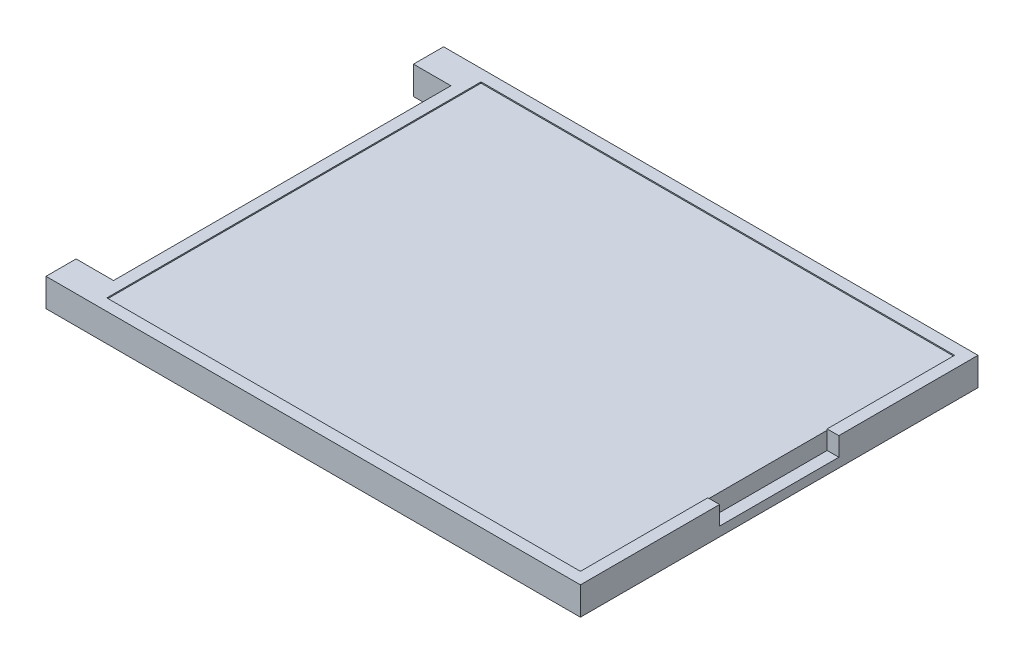
ISO-10303-21;
HEADER;
FILE_DESCRIPTION(('STEP AP214'),'2;1');
FILE_NAME('part.step','',(''),(''),'','','');
FILE_SCHEMA(('AUTOMOTIVE_DESIGN { 1 0 10303 214 1 1 1 1 }'));
ENDSEC;
DATA;
#1=APPLICATION_CONTEXT('core data for automotive mechanical design processes');
#2=APPLICATION_PROTOCOL_DEFINITION('international standard','automotive_design',2000,#1);
#3=PRODUCT_CONTEXT('',#1,'mechanical');
#4=PRODUCT('Part','Part','',(#3));
#5=PRODUCT_RELATED_PRODUCT_CATEGORY('part','',(#4));
#6=PRODUCT_DEFINITION_FORMATION('','',#4);
#7=PRODUCT_DEFINITION_CONTEXT('part definition',#1,'design');
#8=PRODUCT_DEFINITION('design','',#6,#7);
#9=PRODUCT_DEFINITION_SHAPE('','',#8);
#10=(LENGTH_UNIT() NAMED_UNIT(*) SI_UNIT(.MILLI.,.METRE.));
#11=(NAMED_UNIT(*) PLANE_ANGLE_UNIT() SI_UNIT($,.RADIAN.));
#12=(NAMED_UNIT(*) SI_UNIT($,.STERADIAN.) SOLID_ANGLE_UNIT());
#13=UNCERTAINTY_MEASURE_WITH_UNIT(LENGTH_MEASURE(1.E-05),#10,'distance_accuracy_value','');
#14=(GEOMETRIC_REPRESENTATION_CONTEXT(3) GLOBAL_UNCERTAINTY_ASSIGNED_CONTEXT((#13)) GLOBAL_UNIT_ASSIGNED_CONTEXT((#10,
#11,#12)) REPRESENTATION_CONTEXT('',''));
#15=CARTESIAN_POINT('',(0.,0.,0.));
#16=DIRECTION('',(0.,0.,1.));
#17=DIRECTION('',(1.,0.,0.));
#18=AXIS2_PLACEMENT_3D('',#15,#16,#17);
#19=CARTESIAN_POINT('',(23.8,4.,-16.));
#20=DIRECTION('',(1.,0.,0.));
#21=DIRECTION('',(0.,0.,-1.));
#22=AXIS2_PLACEMENT_3D('',#19,#20,#21);
#23=PLANE('',#22);
#24=DIRECTION('',(0.,0.,-1.));
#25=VECTOR('',#24,1.);
#26=CARTESIAN_POINT('',(23.8,4.1,-16.));
#27=LINE('',#26,#25);
#28=CARTESIAN_POINT('',(23.8,4.1,16.));
#29=VERTEX_POINT('',#28);
#30=CARTESIAN_POINT('',(23.8,4.1,5.1));
#31=VERTEX_POINT('',#30);
#32=EDGE_CURVE('E209',#29,#31,#27,.T.);
#33=ORIENTED_EDGE('',*,*,#32,.T.);
#34=DIRECTION('',(0.,1.,0.));
#35=VECTOR('',#34,1.);
#36=CARTESIAN_POINT('',(23.8,2.5,5.1));
#37=LINE('',#36,#35);
#38=CARTESIAN_POINT('',(23.8,4.,5.1));
#39=VERTEX_POINT('',#38);
#40=EDGE_CURVE('E316',#39,#31,#37,.T.);
#41=ORIENTED_EDGE('',*,*,#40,.F.);
#42=DIRECTION('',(0.,0.,-1.));
#43=VECTOR('',#42,1.);
#44=CARTESIAN_POINT('',(23.8,4.,-16.));
#45=LINE('',#44,#43);
#46=CARTESIAN_POINT('',(23.8,4.,16.));
#47=VERTEX_POINT('',#46);
#48=EDGE_CURVE('E195',#47,#39,#45,.T.);
#49=ORIENTED_EDGE('',*,*,#48,.F.);
#50=DIRECTION('',(0.,1.,0.));
#51=VECTOR('',#50,1.);
#52=CARTESIAN_POINT('',(23.8,4.,16.));
#53=LINE('',#52,#51);
#54=EDGE_CURVE('E220',#47,#29,#53,.T.);
#55=ORIENTED_EDGE('',*,*,#54,.T.);
#56=EDGE_LOOP('',(#33,#41,#49,#55));
#57=FACE_BOUND('',#56,.T.);
#58=ADVANCED_FACE('F38',(#57),#23,.F.);
#59=CARTESIAN_POINT('',(0.,4.1,-14.425));
#60=DIRECTION('',(0.,0.,-1.));
#61=DIRECTION('',(-1.,0.,0.));
#62=AXIS2_PLACEMENT_3D('',#59,#60,#61);
#63=PLANE('',#62);
#64=DIRECTION('',(1.,0.,0.));
#65=VECTOR('',#64,1.);
#66=CARTESIAN_POINT('',(0.,1.7,-14.425));
#67=LINE('',#66,#65);
#68=CARTESIAN_POINT('',(-20.9,1.7,-14.425));
#69=VERTEX_POINT('',#68);
#70=CARTESIAN_POINT('',(-17.7,1.7,-14.425));
#71=VERTEX_POINT('',#70);
#72=EDGE_CURVE('E216',#69,#71,#67,.T.);
#73=ORIENTED_EDGE('',*,*,#72,.T.);
#74=DIRECTION('',(0.,-1.,0.));
#75=VECTOR('',#74,1.);
#76=CARTESIAN_POINT('',(-17.7,4.1,-14.425));
#77=LINE('',#76,#75);
#78=CARTESIAN_POINT('',(-17.7,4.1,-14.425));
#79=VERTEX_POINT('',#78);
#80=EDGE_CURVE('E11',#79,#71,#77,.T.);
#81=ORIENTED_EDGE('',*,*,#80,.F.);
#82=DIRECTION('',(1.,0.,0.));
#83=VECTOR('',#82,1.);
#84=CARTESIAN_POINT('',(0.,4.1,-14.425));
#85=LINE('',#84,#83);
#86=CARTESIAN_POINT('',(-20.9,4.1,-14.425));
#87=VERTEX_POINT('',#86);
#88=EDGE_CURVE('E223',#87,#79,#85,.T.);
#89=ORIENTED_EDGE('',*,*,#88,.F.);
#90=DIRECTION('',(0.,-1.,0.));
#91=VECTOR('',#90,1.);
#92=CARTESIAN_POINT('',(-20.9,4.1,-14.425));
#93=LINE('',#92,#91);
#94=EDGE_CURVE('E258',#87,#69,#93,.T.);
#95=ORIENTED_EDGE('',*,*,#94,.T.);
#96=EDGE_LOOP('',(#73,#81,#89,#95));
#97=FACE_BOUND('',#96,.T.);
#98=ADVANCED_FACE('F40',(#97),#63,.F.);
#99=CARTESIAN_POINT('',(-17.7,4.1,0.));
#100=DIRECTION('',(1.,0.,0.));
#101=DIRECTION('',(0.,0.,-1.));
#102=AXIS2_PLACEMENT_3D('',#99,#100,#101);
#103=PLANE('',#102);
#104=DIRECTION('',(0.,0.,1.));
#105=VECTOR('',#104,1.);
#106=CARTESIAN_POINT('',(-17.7,1.7,0.));
#107=LINE('',#106,#105);
#108=CARTESIAN_POINT('',(-17.7,1.7,14.425));
#109=VERTEX_POINT('',#108);
#110=EDGE_CURVE('E244',#71,#109,#107,.T.);
#111=ORIENTED_EDGE('',*,*,#110,.T.);
#112=DIRECTION('',(0.,-1.,0.));
#113=VECTOR('',#112,1.);
#114=CARTESIAN_POINT('',(-17.7,4.1,14.425));
#115=LINE('',#114,#113);
#116=CARTESIAN_POINT('',(-17.7,4.1,14.425));
#117=VERTEX_POINT('',#116);
#118=EDGE_CURVE('E46',#117,#109,#115,.T.);
#119=ORIENTED_EDGE('',*,*,#118,.F.);
#120=DIRECTION('',(0.,0.,1.));
#121=VECTOR('',#120,1.);
#122=CARTESIAN_POINT('',(-17.7,4.1,0.));
#123=LINE('',#122,#121);
#124=EDGE_CURVE('E226',#79,#117,#123,.T.);
#125=ORIENTED_EDGE('',*,*,#124,.F.);
#126=ORIENTED_EDGE('',*,*,#80,.T.);
#127=EDGE_LOOP('',(#111,#119,#125,#126));
#128=FACE_BOUND('',#127,.T.);
#129=ADVANCED_FACE('F280',(#128),#103,.F.);
#130=CARTESIAN_POINT('',(0.,4.1,14.425));
#131=DIRECTION('',(0.,0.,-1.));
#132=DIRECTION('',(-1.,0.,0.));
#133=AXIS2_PLACEMENT_3D('',#130,#131,#132);
#134=PLANE('',#133);
#135=DIRECTION('',(1.,0.,0.));
#136=VECTOR('',#135,1.);
#137=CARTESIAN_POINT('',(0.,1.7,14.425));
#138=LINE('',#137,#136);
#139=CARTESIAN_POINT('',(-20.9,1.7,14.425));
#140=VERTEX_POINT('',#139);
#141=EDGE_CURVE('E247',#140,#109,#138,.T.);
#142=ORIENTED_EDGE('',*,*,#141,.F.);
#143=DIRECTION('',(0.,-1.,0.));
#144=VECTOR('',#143,1.);
#145=CARTESIAN_POINT('',(-20.9,4.1,14.425));
#146=LINE('',#145,#144);
#147=CARTESIAN_POINT('',(-20.9,4.1,14.425));
#148=VERTEX_POINT('',#147);
#149=EDGE_CURVE('E273',#148,#140,#146,.T.);
#150=ORIENTED_EDGE('',*,*,#149,.F.);
#151=DIRECTION('',(1.,0.,0.));
#152=VECTOR('',#151,1.);
#153=CARTESIAN_POINT('',(0.,4.1,14.425));
#154=LINE('',#153,#152);
#155=EDGE_CURVE('E229',#148,#117,#154,.T.);
#156=ORIENTED_EDGE('',*,*,#155,.T.);
#157=ORIENTED_EDGE('',*,*,#118,.T.);
#158=EDGE_LOOP('',(#142,#150,#156,#157));
#159=FACE_BOUND('',#158,.T.);
#160=ADVANCED_FACE('F277',(#159),#134,.T.);
#161=CARTESIAN_POINT('',(-20.9,4.1,0.));
#162=DIRECTION('',(1.,0.,0.));
#163=DIRECTION('',(0.,0.,-1.));
#164=AXIS2_PLACEMENT_3D('',#161,#162,#163);
#165=PLANE('',#164);
#166=DIRECTION('',(0.,0.,1.));
#167=VECTOR('',#166,1.);
#168=CARTESIAN_POINT('',(-20.9,1.7,0.));
#169=LINE('',#168,#167);
#170=CARTESIAN_POINT('',(-20.9,1.7,17.));
#171=VERTEX_POINT('',#170);
#172=EDGE_CURVE('E250',#140,#171,#169,.T.);
#173=ORIENTED_EDGE('',*,*,#172,.T.);
#174=DIRECTION('',(0.,-1.,0.));
#175=VECTOR('',#174,1.);
#176=CARTESIAN_POINT('',(-20.9,4.1,17.));
#177=LINE('',#176,#175);
#178=CARTESIAN_POINT('',(-20.9,4.1,17.));
#179=VERTEX_POINT('',#178);
#180=EDGE_CURVE('E270',#179,#171,#177,.T.);
#181=ORIENTED_EDGE('',*,*,#180,.F.);
#182=DIRECTION('',(0.,0.,1.));
#183=VECTOR('',#182,1.);
#184=CARTESIAN_POINT('',(-20.9,4.1,0.));
#185=LINE('',#184,#183);
#186=EDGE_CURVE('E232',#148,#179,#185,.T.);
#187=ORIENTED_EDGE('',*,*,#186,.F.);
#188=ORIENTED_EDGE('',*,*,#149,.T.);
#189=EDGE_LOOP('',(#173,#181,#187,#188));
#190=FACE_BOUND('',#189,.T.);
#191=ADVANCED_FACE('F290',(#190),#165,.F.);
#192=CARTESIAN_POINT('',(0.,4.1,17.));
#193=DIRECTION('',(0.,0.,-1.));
#194=DIRECTION('',(-1.,0.,0.));
#195=AXIS2_PLACEMENT_3D('',#192,#193,#194);
#196=PLANE('',#195);
#197=DIRECTION('',(1.,0.,0.));
#198=VECTOR('',#197,1.);
#199=CARTESIAN_POINT('',(0.,1.7,17.));
#200=LINE('',#199,#198);
#201=CARTESIAN_POINT('',(24.8,1.7,17.));
#202=VERTEX_POINT('',#201);
#203=EDGE_CURVE('E252',#171,#202,#200,.T.);
#204=ORIENTED_EDGE('',*,*,#203,.T.);
#205=DIRECTION('',(0.,-1.,0.));
#206=VECTOR('',#205,1.);
#207=CARTESIAN_POINT('',(24.8,4.1,17.));
#208=LINE('',#207,#206);
#209=CARTESIAN_POINT('',(24.8,4.1,17.));
#210=VERTEX_POINT('',#209);
#211=EDGE_CURVE('E267',#210,#202,#208,.T.);
#212=ORIENTED_EDGE('',*,*,#211,.F.);
#213=DIRECTION('',(1.,0.,0.));
#214=VECTOR('',#213,1.);
#215=CARTESIAN_POINT('',(0.,4.1,17.));
#216=LINE('',#215,#214);
#217=EDGE_CURVE('E234',#179,#210,#216,.T.);
#218=ORIENTED_EDGE('',*,*,#217,.F.);
#219=ORIENTED_EDGE('',*,*,#180,.T.);
#220=EDGE_LOOP('',(#204,#212,#218,#219));
#221=FACE_BOUND('',#220,.T.);
#222=ADVANCED_FACE('F294',(#221),#196,.F.);
#223=CARTESIAN_POINT('',(24.8,4.1,0.));
#224=DIRECTION('',(-1.,0.,0.));
#225=DIRECTION('',(0.,0.,1.));
#226=AXIS2_PLACEMENT_3D('',#223,#224,#225);
#227=PLANE('',#226);
#228=DIRECTION('',(0.,0.,-1.));
#229=VECTOR('',#228,1.);
#230=CARTESIAN_POINT('',(24.8,2.5,-5.1));
#231=LINE('',#230,#229);
#232=CARTESIAN_POINT('',(24.8,2.5,5.1));
#233=VERTEX_POINT('',#232);
#234=CARTESIAN_POINT('',(24.8,2.5,-5.1));
#235=VERTEX_POINT('',#234);
#236=EDGE_CURVE('E165',#233,#235,#231,.T.);
#237=ORIENTED_EDGE('',*,*,#236,.F.);
#238=DIRECTION('',(0.,1.,0.));
#239=VECTOR('',#238,1.);
#240=CARTESIAN_POINT('',(24.8,2.5,5.1));
#241=LINE('',#240,#239);
#242=CARTESIAN_POINT('',(24.8,4.1,5.1));
#243=VERTEX_POINT('',#242);
#244=EDGE_CURVE('E205',#233,#243,#241,.T.);
#245=ORIENTED_EDGE('',*,*,#244,.T.);
#246=DIRECTION('',(0.,0.,-1.));
#247=VECTOR('',#246,1.);
#248=CARTESIAN_POINT('',(24.8,4.1,0.));
#249=LINE('',#248,#247);
#250=EDGE_CURVE('E237',#210,#243,#249,.T.);
#251=ORIENTED_EDGE('',*,*,#250,.F.);
#252=ORIENTED_EDGE('',*,*,#211,.T.);
#253=DIRECTION('',(0.,0.,-1.));
#254=VECTOR('',#253,1.);
#255=CARTESIAN_POINT('',(24.8,1.7,0.));
#256=LINE('',#255,#254);
#257=CARTESIAN_POINT('',(24.8,1.7,-17.));
#258=VERTEX_POINT('',#257);
#259=EDGE_CURVE('E254',#202,#258,#256,.T.);
#260=ORIENTED_EDGE('',*,*,#259,.T.);
#261=DIRECTION('',(0.,-1.,0.));
#262=VECTOR('',#261,1.);
#263=CARTESIAN_POINT('',(24.8,4.1,-17.));
#264=LINE('',#263,#262);
#265=CARTESIAN_POINT('',(24.8,4.1,-17.));
#266=VERTEX_POINT('',#265);
#267=EDGE_CURVE('E264',#266,#258,#264,.T.);
#268=ORIENTED_EDGE('',*,*,#267,.F.);
#269=CARTESIAN_POINT('',(24.8,4.1,-5.1));
#270=VERTEX_POINT('',#269);
#271=EDGE_CURVE('E179',#270,#266,#249,.T.);
#272=ORIENTED_EDGE('',*,*,#271,.F.);
#273=DIRECTION('',(0.,1.,0.));
#274=VECTOR('',#273,1.);
#275=CARTESIAN_POINT('',(24.8,2.5,-5.1));
#276=LINE('',#275,#274);
#277=EDGE_CURVE('E160',#235,#270,#276,.T.);
#278=ORIENTED_EDGE('',*,*,#277,.F.);
#279=EDGE_LOOP('',(#237,#245,#251,#252,#260,#268,#272,#278));
#280=FACE_BOUND('',#279,.T.);
#281=ADVANCED_FACE('F177',(#280),#227,.F.);
#282=CARTESIAN_POINT('',(0.,4.1,-17.));
#283=DIRECTION('',(0.,0.,1.));
#284=DIRECTION('',(1.,0.,0.));
#285=AXIS2_PLACEMENT_3D('',#282,#283,#284);
#286=PLANE('',#285);
#287=DIRECTION('',(-1.,0.,0.));
#288=VECTOR('',#287,1.);
#289=CARTESIAN_POINT('',(0.,1.7,-17.));
#290=LINE('',#289,#288);
#291=CARTESIAN_POINT('',(-20.9,1.7,-17.));
#292=VERTEX_POINT('',#291);
#293=EDGE_CURVE('E256',#258,#292,#290,.T.);
#294=ORIENTED_EDGE('',*,*,#293,.T.);
#295=DIRECTION('',(0.,-1.,0.));
#296=VECTOR('',#295,1.);
#297=CARTESIAN_POINT('',(-20.9,4.1,-17.));
#298=LINE('',#297,#296);
#299=CARTESIAN_POINT('',(-20.9,4.1,-17.));
#300=VERTEX_POINT('',#299);
#301=EDGE_CURVE('E261',#300,#292,#298,.T.);
#302=ORIENTED_EDGE('',*,*,#301,.F.);
#303=DIRECTION('',(-1.,0.,0.));
#304=VECTOR('',#303,1.);
#305=CARTESIAN_POINT('',(0.,4.1,-17.));
#306=LINE('',#305,#304);
#307=EDGE_CURVE('E240',#266,#300,#306,.T.);
#308=ORIENTED_EDGE('',*,*,#307,.F.);
#309=ORIENTED_EDGE('',*,*,#267,.T.);
#310=EDGE_LOOP('',(#294,#302,#308,#309));
#311=FACE_BOUND('',#310,.T.);
#312=ADVANCED_FACE('F311',(#311),#286,.F.);
#313=EDGE_CURVE('E227',#292,#69,#169,.T.);
#314=ORIENTED_EDGE('',*,*,#313,.T.);
#315=ORIENTED_EDGE('',*,*,#94,.F.);
#316=EDGE_CURVE('E235',#300,#87,#185,.T.);
#317=ORIENTED_EDGE('',*,*,#316,.F.);
#318=ORIENTED_EDGE('',*,*,#301,.T.);
#319=EDGE_LOOP('',(#314,#315,#317,#318));
#320=FACE_BOUND('',#319,.T.);
#321=ADVANCED_FACE('F307',(#320),#165,.F.);
#322=CARTESIAN_POINT('',(0.,4.1,0.));
#323=DIRECTION('',(0.,1.,0.));
#324=DIRECTION('',(0.,0.,1.));
#325=AXIS2_PLACEMENT_3D('',#322,#323,#324);
#326=PLANE('',#325);
#327=DIRECTION('',(1.,0.,0.));
#328=VECTOR('',#327,1.);
#329=CARTESIAN_POINT('',(24.8,4.1,5.1));
#330=LINE('',#329,#328);
#331=EDGE_CURVE('E174',#31,#243,#330,.T.);
#332=ORIENTED_EDGE('',*,*,#331,.F.);
#333=ORIENTED_EDGE('',*,*,#32,.F.);
#334=DIRECTION('',(1.,0.,0.));
#335=VECTOR('',#334,1.);
#336=CARTESIAN_POINT('',(-16.7,4.1,16.));
#337=LINE('',#336,#335);
#338=CARTESIAN_POINT('',(-16.7,4.1,16.));
#339=VERTEX_POINT('',#338);
#340=EDGE_CURVE('E204',#339,#29,#337,.T.);
#341=ORIENTED_EDGE('',*,*,#340,.F.);
#342=DIRECTION('',(0.,0.,1.));
#343=VECTOR('',#342,1.);
#344=CARTESIAN_POINT('',(-16.7,4.1,-16.));
#345=LINE('',#344,#343);
#346=CARTESIAN_POINT('',(-16.7,4.1,-16.));
#347=VERTEX_POINT('',#346);
#348=EDGE_CURVE('E61',#347,#339,#345,.T.);
#349=ORIENTED_EDGE('',*,*,#348,.F.);
#350=DIRECTION('',(-1.,0.,0.));
#351=VECTOR('',#350,1.);
#352=CARTESIAN_POINT('',(-16.7,4.1,-16.));
#353=LINE('',#352,#351);
#354=CARTESIAN_POINT('',(23.8,4.1,-16.));
#355=VERTEX_POINT('',#354);
#356=EDGE_CURVE('E191',#355,#347,#353,.T.);
#357=ORIENTED_EDGE('',*,*,#356,.F.);
#358=CARTESIAN_POINT('',(23.8,4.1,-5.1));
#359=VERTEX_POINT('',#358);
#360=EDGE_CURVE('E208',#359,#355,#27,.T.);
#361=ORIENTED_EDGE('',*,*,#360,.F.);
#362=DIRECTION('',(-1.,0.,0.));
#363=VECTOR('',#362,1.);
#364=CARTESIAN_POINT('',(24.8,4.1,-5.1));
#365=LINE('',#364,#363);
#366=EDGE_CURVE('E319',#270,#359,#365,.T.);
#367=ORIENTED_EDGE('',*,*,#366,.F.);
#368=ORIENTED_EDGE('',*,*,#271,.T.);
#369=ORIENTED_EDGE('',*,*,#307,.T.);
#370=ORIENTED_EDGE('',*,*,#316,.T.);
#371=ORIENTED_EDGE('',*,*,#88,.T.);
#372=ORIENTED_EDGE('',*,*,#124,.T.);
#373=ORIENTED_EDGE('',*,*,#155,.F.);
#374=ORIENTED_EDGE('',*,*,#186,.T.);
#375=ORIENTED_EDGE('',*,*,#217,.T.);
#376=ORIENTED_EDGE('',*,*,#250,.T.);
#377=EDGE_LOOP('',(#332,#333,#341,#349,#357,#361,#367,#368,#369,#370,#371,#372,#373,#374,#375,#376));
#378=FACE_BOUND('',#377,.T.);
#379=ADVANCED_FACE('F299',(#378),#326,.T.);
#380=CARTESIAN_POINT('',(0.,1.7,0.));
#381=DIRECTION('',(0.,1.,0.));
#382=DIRECTION('',(0.,0.,1.));
#383=AXIS2_PLACEMENT_3D('',#380,#381,#382);
#384=PLANE('',#383);
#385=ORIENTED_EDGE('',*,*,#72,.F.);
#386=ORIENTED_EDGE('',*,*,#313,.F.);
#387=ORIENTED_EDGE('',*,*,#293,.F.);
#388=ORIENTED_EDGE('',*,*,#259,.F.);
#389=ORIENTED_EDGE('',*,*,#203,.F.);
#390=ORIENTED_EDGE('',*,*,#172,.F.);
#391=ORIENTED_EDGE('',*,*,#141,.T.);
#392=ORIENTED_EDGE('',*,*,#110,.F.);
#393=EDGE_LOOP('',(#385,#386,#387,#388,#389,#390,#391,#392));
#394=FACE_BOUND('',#393,.T.);
#395=ADVANCED_FACE('F285',(#394),#384,.F.);
#396=CARTESIAN_POINT('',(-16.7,4.,-16.));
#397=DIRECTION('',(-1.,0.,0.));
#398=DIRECTION('',(0.,0.,1.));
#399=AXIS2_PLACEMENT_3D('',#396,#397,#398);
#400=PLANE('',#399);
#401=ORIENTED_EDGE('',*,*,#348,.T.);
#402=DIRECTION('',(0.,1.,0.));
#403=VECTOR('',#402,1.);
#404=CARTESIAN_POINT('',(-16.7,4.,16.));
#405=LINE('',#404,#403);
#406=CARTESIAN_POINT('',(-16.7,4.,16.));
#407=VERTEX_POINT('',#406);
#408=EDGE_CURVE('E202',#407,#339,#405,.T.);
#409=ORIENTED_EDGE('',*,*,#408,.F.);
#410=DIRECTION('',(0.,0.,1.));
#411=VECTOR('',#410,1.);
#412=CARTESIAN_POINT('',(-16.7,4.,-16.));
#413=LINE('',#412,#411);
#414=CARTESIAN_POINT('',(-16.7,4.,-16.));
#415=VERTEX_POINT('',#414);
#416=EDGE_CURVE('E187',#415,#407,#413,.T.);
#417=ORIENTED_EDGE('',*,*,#416,.F.);
#418=DIRECTION('',(0.,1.,0.));
#419=VECTOR('',#418,1.);
#420=CARTESIAN_POINT('',(-16.7,4.,-16.));
#421=LINE('',#420,#419);
#422=EDGE_CURVE('E214',#415,#347,#421,.T.);
#423=ORIENTED_EDGE('',*,*,#422,.T.);
#424=EDGE_LOOP('',(#401,#409,#417,#423));
#425=FACE_BOUND('',#424,.T.);
#426=ADVANCED_FACE('F350',(#425),#400,.F.);
#427=CARTESIAN_POINT('',(-16.7,4.,-16.));
#428=DIRECTION('',(0.,0.,-1.));
#429=DIRECTION('',(-1.,0.,0.));
#430=AXIS2_PLACEMENT_3D('',#427,#428,#429);
#431=PLANE('',#430);
#432=ORIENTED_EDGE('',*,*,#356,.T.);
#433=ORIENTED_EDGE('',*,*,#422,.F.);
#434=DIRECTION('',(-1.,0.,0.));
#435=VECTOR('',#434,1.);
#436=CARTESIAN_POINT('',(-16.7,4.,-16.));
#437=LINE('',#436,#435);
#438=CARTESIAN_POINT('',(23.8,4.,-16.));
#439=VERTEX_POINT('',#438);
#440=EDGE_CURVE('E198',#439,#415,#437,.T.);
#441=ORIENTED_EDGE('',*,*,#440,.F.);
#442=DIRECTION('',(0.,1.,0.));
#443=VECTOR('',#442,1.);
#444=CARTESIAN_POINT('',(23.8,4.,-16.));
#445=LINE('',#444,#443);
#446=EDGE_CURVE('E217',#439,#355,#445,.T.);
#447=ORIENTED_EDGE('',*,*,#446,.T.);
#448=EDGE_LOOP('',(#432,#433,#441,#447));
#449=FACE_BOUND('',#448,.T.);
#450=ADVANCED_FACE('F337',(#449),#431,.F.);
#451=CARTESIAN_POINT('',(23.8,4.,-5.1));
#452=VERTEX_POINT('',#451);
#453=EDGE_CURVE('E194',#452,#439,#45,.T.);
#454=ORIENTED_EDGE('',*,*,#453,.F.);
#455=DIRECTION('',(0.,1.,0.));
#456=VECTOR('',#455,1.);
#457=CARTESIAN_POINT('',(23.8,2.5,-5.1));
#458=LINE('',#457,#456);
#459=EDGE_CURVE('E180',#452,#359,#458,.T.);
#460=ORIENTED_EDGE('',*,*,#459,.T.);
#461=ORIENTED_EDGE('',*,*,#360,.T.);
#462=ORIENTED_EDGE('',*,*,#446,.F.);
#463=EDGE_LOOP('',(#454,#460,#461,#462));
#464=FACE_BOUND('',#463,.T.);
#465=ADVANCED_FACE('F342',(#464),#23,.F.);
#466=CARTESIAN_POINT('',(-16.7,4.,16.));
#467=DIRECTION('',(0.,0.,1.));
#468=DIRECTION('',(1.,0.,0.));
#469=AXIS2_PLACEMENT_3D('',#466,#467,#468);
#470=PLANE('',#469);
#471=ORIENTED_EDGE('',*,*,#340,.T.);
#472=ORIENTED_EDGE('',*,*,#54,.F.);
#473=DIRECTION('',(1.,0.,0.));
#474=VECTOR('',#473,1.);
#475=CARTESIAN_POINT('',(-16.7,4.,16.));
#476=LINE('',#475,#474);
#477=EDGE_CURVE('E190',#407,#47,#476,.T.);
#478=ORIENTED_EDGE('',*,*,#477,.F.);
#479=ORIENTED_EDGE('',*,*,#408,.T.);
#480=EDGE_LOOP('',(#471,#472,#478,#479));
#481=FACE_BOUND('',#480,.T.);
#482=ADVANCED_FACE('F332',(#481),#470,.F.);
#483=CARTESIAN_POINT('',(0.,4.,0.));
#484=DIRECTION('',(0.,1.,0.));
#485=DIRECTION('',(0.,0.,1.));
#486=AXIS2_PLACEMENT_3D('',#483,#484,#485);
#487=PLANE('',#486);
#488=ORIENTED_EDGE('',*,*,#416,.T.);
#489=ORIENTED_EDGE('',*,*,#477,.T.);
#490=ORIENTED_EDGE('',*,*,#48,.T.);
#491=EDGE_CURVE('E199',#39,#452,#45,.T.);
#492=ORIENTED_EDGE('',*,*,#491,.T.);
#493=ORIENTED_EDGE('',*,*,#453,.T.);
#494=ORIENTED_EDGE('',*,*,#440,.T.);
#495=EDGE_LOOP('',(#488,#489,#490,#492,#493,#494));
#496=FACE_BOUND('',#495,.T.);
#497=ADVANCED_FACE('F328',(#496),#487,.T.);
#498=CARTESIAN_POINT('',(24.8,2.5,5.1));
#499=DIRECTION('',(0.,0.,1.));
#500=DIRECTION('',(1.,0.,0.));
#501=AXIS2_PLACEMENT_3D('',#498,#499,#500);
#502=PLANE('',#501);
#503=ORIENTED_EDGE('',*,*,#331,.T.);
#504=ORIENTED_EDGE('',*,*,#244,.F.);
#505=DIRECTION('',(1.,0.,0.));
#506=VECTOR('',#505,1.);
#507=CARTESIAN_POINT('',(24.8,2.5,5.1));
#508=LINE('',#507,#506);
#509=CARTESIAN_POINT('',(23.8,2.5,5.1));
#510=VERTEX_POINT('',#509);
#511=EDGE_CURVE('E171',#510,#233,#508,.T.);
#512=ORIENTED_EDGE('',*,*,#511,.F.);
#513=EDGE_CURVE('E313',#510,#39,#37,.T.);
#514=ORIENTED_EDGE('',*,*,#513,.T.);
#515=ORIENTED_EDGE('',*,*,#40,.T.);
#516=EDGE_LOOP('',(#503,#504,#512,#514,#515));
#517=FACE_BOUND('',#516,.T.);
#518=ADVANCED_FACE('F321',(#517),#502,.F.);
#519=CARTESIAN_POINT('',(23.8,2.5,-5.1));
#520=DIRECTION('',(-1.,0.,0.));
#521=DIRECTION('',(0.,0.,1.));
#522=AXIS2_PLACEMENT_3D('',#519,#520,#521);
#523=PLANE('',#522);
#524=ORIENTED_EDGE('',*,*,#491,.F.);
#525=ORIENTED_EDGE('',*,*,#513,.F.);
#526=DIRECTION('',(0.,0.,1.));
#527=VECTOR('',#526,1.);
#528=CARTESIAN_POINT('',(23.8,2.5,-5.1));
#529=LINE('',#528,#527);
#530=CARTESIAN_POINT('',(23.8,2.5,-5.1));
#531=VERTEX_POINT('',#530);
#532=EDGE_CURVE('E164',#531,#510,#529,.T.);
#533=ORIENTED_EDGE('',*,*,#532,.F.);
#534=EDGE_CURVE('E53',#531,#452,#458,.T.);
#535=ORIENTED_EDGE('',*,*,#534,.T.);
#536=EDGE_LOOP('',(#524,#525,#533,#535));
#537=FACE_BOUND('',#536,.T.);
#538=ADVANCED_FACE('F433',(#537),#523,.F.);
#539=CARTESIAN_POINT('',(24.8,2.5,-5.1));
#540=DIRECTION('',(0.,0.,-1.));
#541=DIRECTION('',(-1.,0.,0.));
#542=AXIS2_PLACEMENT_3D('',#539,#540,#541);
#543=PLANE('',#542);
#544=ORIENTED_EDGE('',*,*,#366,.T.);
#545=ORIENTED_EDGE('',*,*,#459,.F.);
#546=ORIENTED_EDGE('',*,*,#534,.F.);
#547=DIRECTION('',(-1.,0.,0.));
#548=VECTOR('',#547,1.);
#549=CARTESIAN_POINT('',(24.8,2.5,-5.1));
#550=LINE('',#549,#548);
#551=EDGE_CURVE('E156',#235,#531,#550,.T.);
#552=ORIENTED_EDGE('',*,*,#551,.F.);
#553=ORIENTED_EDGE('',*,*,#277,.T.);
#554=EDGE_LOOP('',(#544,#545,#546,#552,#553));
#555=FACE_BOUND('',#554,.T.);
#556=ADVANCED_FACE('F158',(#555),#543,.F.);
#557=CARTESIAN_POINT('',(0.,2.5,0.));
#558=DIRECTION('',(0.,-1.,0.));
#559=DIRECTION('',(0.,0.,-1.));
#560=AXIS2_PLACEMENT_3D('',#557,#558,#559);
#561=PLANE('',#560);
#562=ORIENTED_EDGE('',*,*,#236,.T.);
#563=ORIENTED_EDGE('',*,*,#551,.T.);
#564=ORIENTED_EDGE('',*,*,#532,.T.);
#565=ORIENTED_EDGE('',*,*,#511,.T.);
#566=EDGE_LOOP('',(#562,#563,#564,#565));
#567=FACE_BOUND('',#566,.T.);
#568=ADVANCED_FACE('F169',(#567),#561,.F.);
#569=CLOSED_SHELL('',(#58,#98,#129,#160,#191,#222,#281,#312,#321,#379,#395,#426,#450,#465,#482,
#497,#518,#538,#556,#568));
#570=MANIFOLD_SOLID_BREP('B2',#569);
#571=ADVANCED_BREP_SHAPE_REPRESENTATION('',(#18,#570),#14);
#572=SHAPE_DEFINITION_REPRESENTATION(#9,#571);
ENDSEC;
END-ISO-10303-21;
